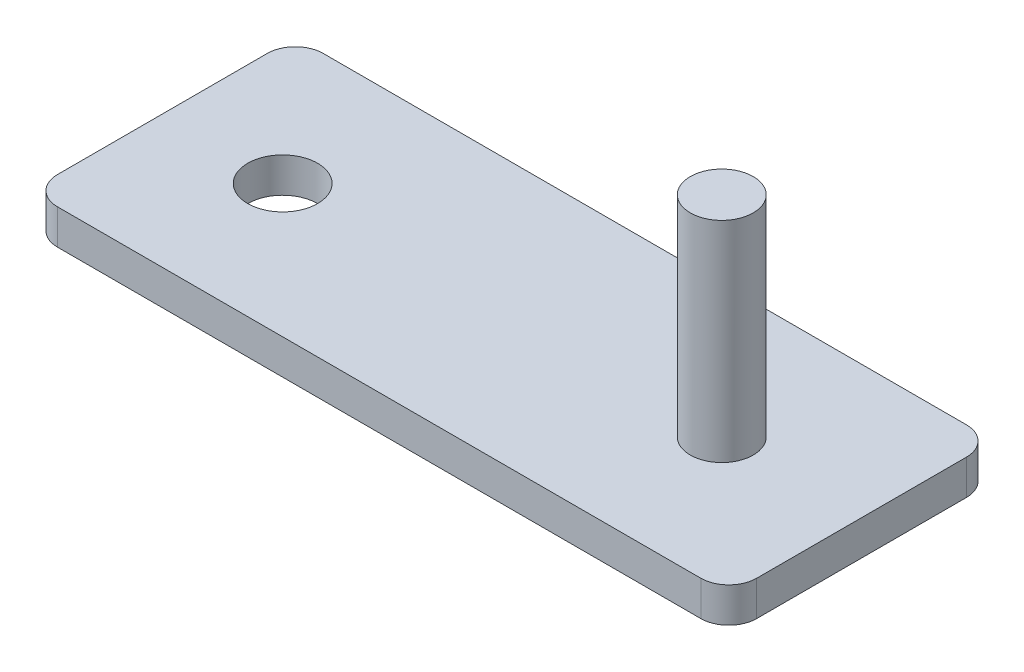
ISO-10303-21;
HEADER;
FILE_DESCRIPTION(('STEP AP214'),'2;1');
FILE_NAME('part.step','',(''),(''),'','','');
FILE_SCHEMA(('AUTOMOTIVE_DESIGN { 1 0 10303 214 1 1 1 1 }'));
ENDSEC;
DATA;
#1=APPLICATION_CONTEXT('core data for automotive mechanical design processes');
#2=APPLICATION_PROTOCOL_DEFINITION('international standard','automotive_design',2000,#1);
#3=PRODUCT_CONTEXT('',#1,'mechanical');
#4=PRODUCT('Part','Part','',(#3));
#5=PRODUCT_RELATED_PRODUCT_CATEGORY('part','',(#4));
#6=PRODUCT_DEFINITION_FORMATION('','',#4);
#7=PRODUCT_DEFINITION_CONTEXT('part definition',#1,'design');
#8=PRODUCT_DEFINITION('design','',#6,#7);
#9=PRODUCT_DEFINITION_SHAPE('','',#8);
#10=(LENGTH_UNIT() NAMED_UNIT(*) SI_UNIT(.MILLI.,.METRE.));
#11=(NAMED_UNIT(*) PLANE_ANGLE_UNIT() SI_UNIT($,.RADIAN.));
#12=(NAMED_UNIT(*) SI_UNIT($,.STERADIAN.) SOLID_ANGLE_UNIT());
#13=UNCERTAINTY_MEASURE_WITH_UNIT(LENGTH_MEASURE(1.E-05),#10,'distance_accuracy_value','');
#14=(GEOMETRIC_REPRESENTATION_CONTEXT(3) GLOBAL_UNCERTAINTY_ASSIGNED_CONTEXT((#13)) GLOBAL_UNIT_ASSIGNED_CONTEXT((#10,
#11,#12)) REPRESENTATION_CONTEXT('',''));
#15=CARTESIAN_POINT('',(0.,0.,0.));
#16=DIRECTION('',(0.,0.,1.));
#17=DIRECTION('',(1.,0.,0.));
#18=AXIS2_PLACEMENT_3D('',#15,#16,#17);
#19=CARTESIAN_POINT('',(0.,2.5,0.));
#20=DIRECTION('',(0.,-1.,0.));
#21=DIRECTION('',(0.,0.,-1.));
#22=AXIS2_PLACEMENT_3D('',#19,#20,#21);
#23=PLANE('',#22);
#24=CARTESIAN_POINT('',(40.,2.5,-9.5));
#25=DIRECTION('',(0.,-1.,0.));
#26=DIRECTION('',(0.,0.,-1.));
#27=AXIS2_PLACEMENT_3D('',#24,#25,#26);
#28=CIRCLE('',#27,2.25);
#29=CARTESIAN_POINT('',(40.,2.5,-11.75));
#30=VERTEX_POINT('',#29);
#31=EDGE_CURVE('E147',#30,#30,#28,.F.);
#32=ORIENTED_EDGE('',*,*,#31,.F.);
#33=EDGE_LOOP('',(#32));
#34=FACE_BOUND('',#33,.T.);
#35=DIRECTION('',(0.,0.,-1.));
#36=VECTOR('',#35,1.);
#37=CARTESIAN_POINT('',(50.,2.5,0.));
#38=LINE('',#37,#36);
#39=CARTESIAN_POINT('',(50.,2.5,-2.));
#40=VERTEX_POINT('',#39);
#41=CARTESIAN_POINT('',(50.,2.5,-17.));
#42=VERTEX_POINT('',#41);
#43=EDGE_CURVE('E186',#40,#42,#38,.T.);
#44=ORIENTED_EDGE('',*,*,#43,.T.);
#45=CARTESIAN_POINT('',(48.,2.5,-17.));
#46=DIRECTION('',(0.,-1.,0.));
#47=DIRECTION('',(0.,0.,-1.));
#48=AXIS2_PLACEMENT_3D('',#45,#46,#47);
#49=CIRCLE('',#48,2.);
#50=CARTESIAN_POINT('',(48.,2.5,-19.));
#51=VERTEX_POINT('',#50);
#52=EDGE_CURVE('E163',#42,#51,#49,.F.);
#53=ORIENTED_EDGE('',*,*,#52,.T.);
#54=DIRECTION('',(-1.,0.,0.));
#55=VECTOR('',#54,1.);
#56=CARTESIAN_POINT('',(0.,2.5,-19.));
#57=LINE('',#56,#55);
#58=CARTESIAN_POINT('',(2.,2.5,-19.));
#59=VERTEX_POINT('',#58);
#60=EDGE_CURVE('E131',#51,#59,#57,.T.);
#61=ORIENTED_EDGE('',*,*,#60,.T.);
#62=CARTESIAN_POINT('',(2.,2.5,-17.));
#63=DIRECTION('',(0.,-1.,0.));
#64=DIRECTION('',(0.,0.,-1.));
#65=AXIS2_PLACEMENT_3D('',#62,#63,#64);
#66=CIRCLE('',#65,2.);
#67=CARTESIAN_POINT('',(0.,2.5,-17.));
#68=VERTEX_POINT('',#67);
#69=EDGE_CURVE('E158',#59,#68,#66,.F.);
#70=ORIENTED_EDGE('',*,*,#69,.T.);
#71=DIRECTION('',(0.,0.,1.));
#72=VECTOR('',#71,1.);
#73=CARTESIAN_POINT('',(0.,2.5,0.));
#74=LINE('',#73,#72);
#75=CARTESIAN_POINT('',(0.,2.5,-2.));
#76=VERTEX_POINT('',#75);
#77=EDGE_CURVE('E138',#68,#76,#74,.T.);
#78=ORIENTED_EDGE('',*,*,#77,.T.);
#79=CARTESIAN_POINT('',(2.,2.5,-2.));
#80=DIRECTION('',(0.,-1.,0.));
#81=DIRECTION('',(0.,0.,-1.));
#82=AXIS2_PLACEMENT_3D('',#79,#80,#81);
#83=CIRCLE('',#82,2.);
#84=CARTESIAN_POINT('',(2.,2.5,0.));
#85=VERTEX_POINT('',#84);
#86=EDGE_CURVE('E67',#76,#85,#83,.F.);
#87=ORIENTED_EDGE('',*,*,#86,.T.);
#88=DIRECTION('',(1.,0.,0.));
#89=VECTOR('',#88,1.);
#90=CARTESIAN_POINT('',(0.,2.5,0.));
#91=LINE('',#90,#89);
#92=CARTESIAN_POINT('',(48.,2.5,0.));
#93=VERTEX_POINT('',#92);
#94=EDGE_CURVE('E141',#85,#93,#91,.T.);
#95=ORIENTED_EDGE('',*,*,#94,.T.);
#96=CARTESIAN_POINT('',(48.,2.5,-2.));
#97=DIRECTION('',(0.,-1.,0.));
#98=DIRECTION('',(0.,0.,-1.));
#99=AXIS2_PLACEMENT_3D('',#96,#97,#98);
#100=CIRCLE('',#99,2.);
#101=EDGE_CURVE('E161',#93,#40,#100,.F.);
#102=ORIENTED_EDGE('',*,*,#101,.T.);
#103=EDGE_LOOP('',(#44,#53,#61,#70,#78,#87,#95,#102));
#104=FACE_BOUND('',#103,.T.);
#105=CARTESIAN_POINT('',(8.6,2.5,-9.5));
#106=DIRECTION('',(0.,1.,0.));
#107=DIRECTION('',(0.,0.,1.));
#108=AXIS2_PLACEMENT_3D('',#105,#106,#107);
#109=CIRCLE('',#108,2.5);
#110=CARTESIAN_POINT('',(8.6,2.5,-7.));
#111=VERTEX_POINT('',#110);
#112=EDGE_CURVE('E179',#111,#111,#109,.T.);
#113=ORIENTED_EDGE('',*,*,#112,.F.);
#114=EDGE_LOOP('',(#113));
#115=FACE_BOUND('',#114,.T.);
#116=ADVANCED_FACE('F45',(#34,#104,#115),#23,.F.);
#117=CARTESIAN_POINT('',(0.,0.,0.));
#118=DIRECTION('',(0.,-1.,0.));
#119=DIRECTION('',(0.,0.,-1.));
#120=AXIS2_PLACEMENT_3D('',#117,#118,#119);
#121=PLANE('',#120);
#122=DIRECTION('',(-1.,0.,0.));
#123=VECTOR('',#122,1.);
#124=CARTESIAN_POINT('',(0.,0.,-19.));
#125=LINE('',#124,#123);
#126=CARTESIAN_POINT('',(48.,0.,-19.));
#127=VERTEX_POINT('',#126);
#128=CARTESIAN_POINT('',(2.,0.,-19.));
#129=VERTEX_POINT('',#128);
#130=EDGE_CURVE('E128',#127,#129,#125,.T.);
#131=ORIENTED_EDGE('',*,*,#130,.F.);
#132=CARTESIAN_POINT('',(48.,0.,-17.));
#133=DIRECTION('',(0.,-1.,0.));
#134=DIRECTION('',(0.,0.,-1.));
#135=AXIS2_PLACEMENT_3D('',#132,#133,#134);
#136=CIRCLE('',#135,2.);
#137=CARTESIAN_POINT('',(50.,0.,-17.));
#138=VERTEX_POINT('',#137);
#139=EDGE_CURVE('E111',#127,#138,#136,.T.);
#140=ORIENTED_EDGE('',*,*,#139,.T.);
#141=DIRECTION('',(0.,0.,-1.));
#142=VECTOR('',#141,1.);
#143=CARTESIAN_POINT('',(50.,0.,0.));
#144=LINE('',#143,#142);
#145=CARTESIAN_POINT('',(50.,0.,-2.));
#146=VERTEX_POINT('',#145);
#147=EDGE_CURVE('E139',#146,#138,#144,.T.);
#148=ORIENTED_EDGE('',*,*,#147,.F.);
#149=CARTESIAN_POINT('',(48.,0.,-2.));
#150=DIRECTION('',(0.,-1.,0.));
#151=DIRECTION('',(0.,0.,-1.));
#152=AXIS2_PLACEMENT_3D('',#149,#150,#151);
#153=CIRCLE('',#152,2.);
#154=CARTESIAN_POINT('',(48.,0.,0.));
#155=VERTEX_POINT('',#154);
#156=EDGE_CURVE('E122',#146,#155,#153,.T.);
#157=ORIENTED_EDGE('',*,*,#156,.T.);
#158=DIRECTION('',(1.,0.,0.));
#159=VECTOR('',#158,1.);
#160=CARTESIAN_POINT('',(0.,0.,0.));
#161=LINE('',#160,#159);
#162=CARTESIAN_POINT('',(2.,0.,0.));
#163=VERTEX_POINT('',#162);
#164=EDGE_CURVE('E143',#163,#155,#161,.T.);
#165=ORIENTED_EDGE('',*,*,#164,.F.);
#166=CARTESIAN_POINT('',(2.,0.,-2.));
#167=DIRECTION('',(0.,-1.,0.));
#168=DIRECTION('',(0.,0.,-1.));
#169=AXIS2_PLACEMENT_3D('',#166,#167,#168);
#170=CIRCLE('',#169,2.);
#171=CARTESIAN_POINT('',(0.,0.,-2.));
#172=VERTEX_POINT('',#171);
#173=EDGE_CURVE('E152',#163,#172,#170,.T.);
#174=ORIENTED_EDGE('',*,*,#173,.T.);
#175=DIRECTION('',(0.,0.,1.));
#176=VECTOR('',#175,1.);
#177=CARTESIAN_POINT('',(0.,0.,0.));
#178=LINE('',#177,#176);
#179=CARTESIAN_POINT('',(0.,0.,-17.));
#180=VERTEX_POINT('',#179);
#181=EDGE_CURVE('E174',#180,#172,#178,.T.);
#182=ORIENTED_EDGE('',*,*,#181,.F.);
#183=CARTESIAN_POINT('',(2.,0.,-17.));
#184=DIRECTION('',(0.,-1.,0.));
#185=DIRECTION('',(0.,0.,-1.));
#186=AXIS2_PLACEMENT_3D('',#183,#184,#185);
#187=CIRCLE('',#186,2.);
#188=EDGE_CURVE('E132',#180,#129,#187,.T.);
#189=ORIENTED_EDGE('',*,*,#188,.T.);
#190=EDGE_LOOP('',(#131,#140,#148,#157,#165,#174,#182,#189));
#191=FACE_BOUND('',#190,.T.);
#192=CARTESIAN_POINT('',(8.6,0.,-9.5));
#193=DIRECTION('',(0.,1.,0.));
#194=DIRECTION('',(0.,0.,1.));
#195=AXIS2_PLACEMENT_3D('',#192,#193,#194);
#196=CIRCLE('',#195,2.5);
#197=CARTESIAN_POINT('',(8.6,0.,-7.));
#198=VERTEX_POINT('',#197);
#199=EDGE_CURVE('E182',#198,#198,#196,.T.);
#200=ORIENTED_EDGE('',*,*,#199,.T.);
#201=EDGE_LOOP('',(#200));
#202=FACE_BOUND('',#201,.T.);
#203=ADVANCED_FACE('F135',(#191,#202),#121,.T.);
#204=CARTESIAN_POINT('',(0.,2.5,0.));
#205=DIRECTION('',(1.,0.,0.));
#206=DIRECTION('',(0.,0.,-1.));
#207=AXIS2_PLACEMENT_3D('',#204,#205,#206);
#208=PLANE('',#207);
#209=ORIENTED_EDGE('',*,*,#181,.T.);
#210=DIRECTION('',(0.,-1.,0.));
#211=VECTOR('',#210,1.);
#212=CARTESIAN_POINT('',(0.,2.5,-2.));
#213=LINE('',#212,#211);
#214=EDGE_CURVE('E11',#172,#76,#213,.F.);
#215=ORIENTED_EDGE('',*,*,#214,.T.);
#216=ORIENTED_EDGE('',*,*,#77,.F.);
#217=DIRECTION('',(0.,-1.,0.));
#218=VECTOR('',#217,1.);
#219=CARTESIAN_POINT('',(0.,2.5,-17.));
#220=LINE('',#219,#218);
#221=EDGE_CURVE('E53',#68,#180,#220,.T.);
#222=ORIENTED_EDGE('',*,*,#221,.T.);
#223=EDGE_LOOP('',(#209,#215,#216,#222));
#224=FACE_BOUND('',#223,.T.);
#225=ADVANCED_FACE('F173',(#224),#208,.F.);
#226=CARTESIAN_POINT('',(0.,2.5,0.));
#227=DIRECTION('',(0.,0.,-1.));
#228=DIRECTION('',(-1.,0.,0.));
#229=AXIS2_PLACEMENT_3D('',#226,#227,#228);
#230=PLANE('',#229);
#231=ORIENTED_EDGE('',*,*,#164,.T.);
#232=DIRECTION('',(0.,-1.,0.));
#233=VECTOR('',#232,1.);
#234=CARTESIAN_POINT('',(48.,2.5,0.));
#235=LINE('',#234,#233);
#236=EDGE_CURVE('E60',#155,#93,#235,.F.);
#237=ORIENTED_EDGE('',*,*,#236,.T.);
#238=ORIENTED_EDGE('',*,*,#94,.F.);
#239=DIRECTION('',(0.,-1.,0.));
#240=VECTOR('',#239,1.);
#241=CARTESIAN_POINT('',(2.,2.5,0.));
#242=LINE('',#241,#240);
#243=EDGE_CURVE('E165',#85,#163,#242,.T.);
#244=ORIENTED_EDGE('',*,*,#243,.T.);
#245=EDGE_LOOP('',(#231,#237,#238,#244));
#246=FACE_BOUND('',#245,.T.);
#247=ADVANCED_FACE('F220',(#246),#230,.F.);
#248=CARTESIAN_POINT('',(50.,2.5,0.));
#249=DIRECTION('',(-1.,0.,0.));
#250=DIRECTION('',(0.,0.,1.));
#251=AXIS2_PLACEMENT_3D('',#248,#249,#250);
#252=PLANE('',#251);
#253=ORIENTED_EDGE('',*,*,#147,.T.);
#254=DIRECTION('',(0.,-1.,0.));
#255=VECTOR('',#254,1.);
#256=CARTESIAN_POINT('',(50.,2.5,-17.));
#257=LINE('',#256,#255);
#258=EDGE_CURVE('E116',#138,#42,#257,.F.);
#259=ORIENTED_EDGE('',*,*,#258,.T.);
#260=ORIENTED_EDGE('',*,*,#43,.F.);
#261=DIRECTION('',(0.,-1.,0.));
#262=VECTOR('',#261,1.);
#263=CARTESIAN_POINT('',(50.,2.5,-2.));
#264=LINE('',#263,#262);
#265=EDGE_CURVE('E121',#40,#146,#264,.T.);
#266=ORIENTED_EDGE('',*,*,#265,.T.);
#267=EDGE_LOOP('',(#253,#259,#260,#266));
#268=FACE_BOUND('',#267,.T.);
#269=ADVANCED_FACE('F225',(#268),#252,.F.);
#270=CARTESIAN_POINT('',(0.,2.5,-19.));
#271=DIRECTION('',(0.,0.,1.));
#272=DIRECTION('',(1.,0.,0.));
#273=AXIS2_PLACEMENT_3D('',#270,#271,#272);
#274=PLANE('',#273);
#275=ORIENTED_EDGE('',*,*,#60,.F.);
#276=DIRECTION('',(0.,-1.,0.));
#277=VECTOR('',#276,1.);
#278=CARTESIAN_POINT('',(48.,2.5,-19.));
#279=LINE('',#278,#277);
#280=EDGE_CURVE('E115',#51,#127,#279,.T.);
#281=ORIENTED_EDGE('',*,*,#280,.T.);
#282=ORIENTED_EDGE('',*,*,#130,.T.);
#283=DIRECTION('',(0.,-1.,0.));
#284=VECTOR('',#283,1.);
#285=CARTESIAN_POINT('',(2.,2.5,-19.));
#286=LINE('',#285,#284);
#287=EDGE_CURVE('E133',#129,#59,#286,.F.);
#288=ORIENTED_EDGE('',*,*,#287,.T.);
#289=EDGE_LOOP('',(#275,#281,#282,#288));
#290=FACE_BOUND('',#289,.T.);
#291=ADVANCED_FACE('F127',(#290),#274,.F.);
#292=CARTESIAN_POINT('',(8.6,2.5,-9.5));
#293=DIRECTION('',(0.,-1.,0.));
#294=DIRECTION('',(0.,0.,-1.));
#295=AXIS2_PLACEMENT_3D('',#292,#293,#294);
#296=CYLINDRICAL_SURFACE('',#295,2.5);
#297=ORIENTED_EDGE('',*,*,#112,.T.);
#298=EDGE_LOOP('',(#297));
#299=FACE_BOUND('',#298,.T.);
#300=ORIENTED_EDGE('',*,*,#199,.F.);
#301=EDGE_LOOP('',(#300));
#302=FACE_BOUND('',#301,.T.);
#303=ADVANCED_FACE('F201',(#299,#302),#296,.F.);
#304=CARTESIAN_POINT('',(40.,17.5,-9.5));
#305=DIRECTION('',(0.,-1.,0.));
#306=DIRECTION('',(0.,0.,-1.));
#307=AXIS2_PLACEMENT_3D('',#304,#305,#306);
#308=CYLINDRICAL_SURFACE('',#307,2.25);
#309=CARTESIAN_POINT('',(40.,17.5,-9.5));
#310=DIRECTION('',(0.,1.,0.));
#311=DIRECTION('',(0.,0.,1.));
#312=AXIS2_PLACEMENT_3D('',#309,#310,#311);
#313=CIRCLE('',#312,2.25);
#314=CARTESIAN_POINT('',(40.,17.5,-7.25));
#315=VERTEX_POINT('',#314);
#316=EDGE_CURVE('E191',#315,#315,#313,.T.);
#317=ORIENTED_EDGE('',*,*,#316,.F.);
#318=EDGE_LOOP('',(#317));
#319=FACE_BOUND('',#318,.T.);
#320=ORIENTED_EDGE('',*,*,#31,.T.);
#321=EDGE_LOOP('',(#320));
#322=FACE_BOUND('',#321,.T.);
#323=ADVANCED_FACE('F198',(#319,#322),#308,.T.);
#324=CARTESIAN_POINT('',(40.,17.5,-9.5));
#325=DIRECTION('',(0.,1.,0.));
#326=DIRECTION('',(0.,0.,1.));
#327=AXIS2_PLACEMENT_3D('',#324,#325,#326);
#328=PLANE('',#327);
#329=ORIENTED_EDGE('',*,*,#316,.T.);
#330=EDGE_LOOP('',(#329));
#331=FACE_BOUND('',#330,.T.);
#332=ADVANCED_FACE('F196',(#331),#328,.T.);
#333=CARTESIAN_POINT('',(48.,2.5,-17.));
#334=DIRECTION('',(0.,-1.,0.));
#335=DIRECTION('',(0.,0.,-1.));
#336=AXIS2_PLACEMENT_3D('',#333,#334,#335);
#337=CYLINDRICAL_SURFACE('',#336,2.);
#338=ORIENTED_EDGE('',*,*,#52,.F.);
#339=ORIENTED_EDGE('',*,*,#258,.F.);
#340=ORIENTED_EDGE('',*,*,#139,.F.);
#341=ORIENTED_EDGE('',*,*,#280,.F.);
#342=EDGE_LOOP('',(#338,#339,#340,#341));
#343=FACE_BOUND('',#342,.T.);
#344=ADVANCED_FACE('F114',(#343),#337,.T.);
#345=CARTESIAN_POINT('',(48.,2.5,-2.));
#346=DIRECTION('',(0.,-1.,0.));
#347=DIRECTION('',(0.,0.,-1.));
#348=AXIS2_PLACEMENT_3D('',#345,#346,#347);
#349=CYLINDRICAL_SURFACE('',#348,2.);
#350=ORIENTED_EDGE('',*,*,#101,.F.);
#351=ORIENTED_EDGE('',*,*,#236,.F.);
#352=ORIENTED_EDGE('',*,*,#156,.F.);
#353=ORIENTED_EDGE('',*,*,#265,.F.);
#354=EDGE_LOOP('',(#350,#351,#352,#353));
#355=FACE_BOUND('',#354,.T.);
#356=ADVANCED_FACE('F233',(#355),#349,.T.);
#357=CARTESIAN_POINT('',(2.,2.5,-2.));
#358=DIRECTION('',(0.,-1.,0.));
#359=DIRECTION('',(0.,0.,-1.));
#360=AXIS2_PLACEMENT_3D('',#357,#358,#359);
#361=CYLINDRICAL_SURFACE('',#360,2.);
#362=ORIENTED_EDGE('',*,*,#86,.F.);
#363=ORIENTED_EDGE('',*,*,#214,.F.);
#364=ORIENTED_EDGE('',*,*,#173,.F.);
#365=ORIENTED_EDGE('',*,*,#243,.F.);
#366=EDGE_LOOP('',(#362,#363,#364,#365));
#367=FACE_BOUND('',#366,.T.);
#368=ADVANCED_FACE('F235',(#367),#361,.T.);
#369=CARTESIAN_POINT('',(2.,2.5,-17.));
#370=DIRECTION('',(0.,-1.,0.));
#371=DIRECTION('',(0.,0.,-1.));
#372=AXIS2_PLACEMENT_3D('',#369,#370,#371);
#373=CYLINDRICAL_SURFACE('',#372,2.);
#374=ORIENTED_EDGE('',*,*,#69,.F.);
#375=ORIENTED_EDGE('',*,*,#287,.F.);
#376=ORIENTED_EDGE('',*,*,#188,.F.);
#377=ORIENTED_EDGE('',*,*,#221,.F.);
#378=EDGE_LOOP('',(#374,#375,#376,#377));
#379=FACE_BOUND('',#378,.T.);
#380=ADVANCED_FACE('F47',(#379),#373,.T.);
#381=CLOSED_SHELL('',(#116,#203,#225,#247,#269,#291,#303,#323,#332,#344,#356,#368,#380));
#382=MANIFOLD_SOLID_BREP('B2',#381);
#383=ADVANCED_BREP_SHAPE_REPRESENTATION('',(#18,#382),#14);
#384=SHAPE_DEFINITION_REPRESENTATION(#9,#383);
ENDSEC;
END-ISO-10303-21;
